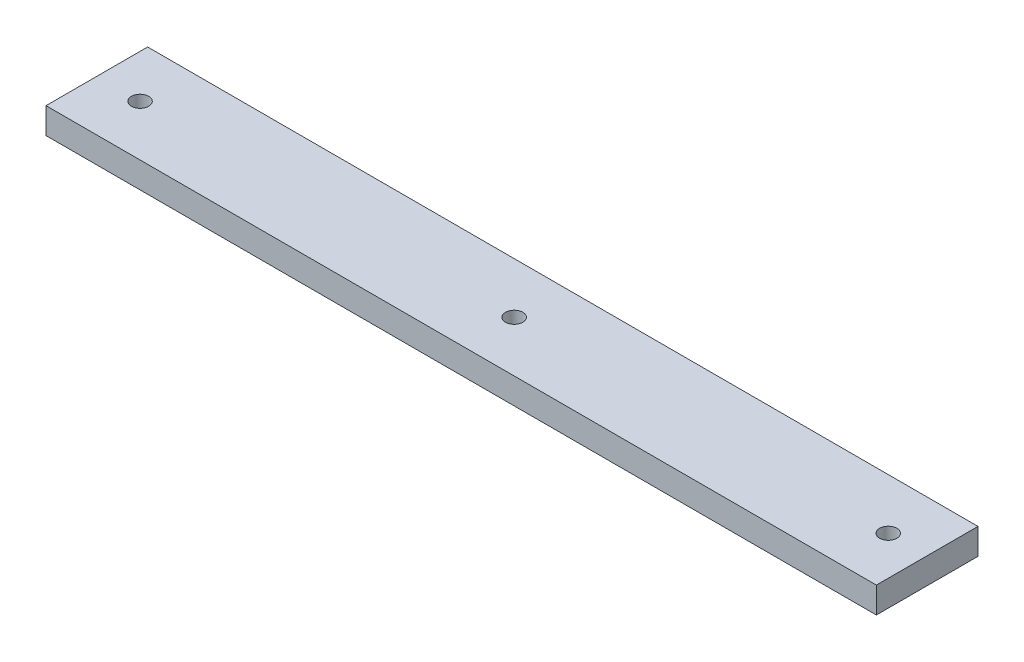
ISO-10303-21;
HEADER;
FILE_DESCRIPTION(('STEP AP214'),'2;1');
FILE_NAME('part.step','',(''),(''),'','','');
FILE_SCHEMA(('AUTOMOTIVE_DESIGN { 1 0 10303 214 1 1 1 1 }'));
ENDSEC;
DATA;
#1=APPLICATION_CONTEXT('core data for automotive mechanical design processes');
#2=APPLICATION_PROTOCOL_DEFINITION('international standard','automotive_design',2000,#1);
#3=PRODUCT_CONTEXT('',#1,'mechanical');
#4=PRODUCT('Part','Part','',(#3));
#5=PRODUCT_RELATED_PRODUCT_CATEGORY('part','',(#4));
#6=PRODUCT_DEFINITION_FORMATION('','',#4);
#7=PRODUCT_DEFINITION_CONTEXT('part definition',#1,'design');
#8=PRODUCT_DEFINITION('design','',#6,#7);
#9=PRODUCT_DEFINITION_SHAPE('','',#8);
#10=(LENGTH_UNIT() NAMED_UNIT(*) SI_UNIT(.MILLI.,.METRE.));
#11=(NAMED_UNIT(*) PLANE_ANGLE_UNIT() SI_UNIT($,.RADIAN.));
#12=(NAMED_UNIT(*) SI_UNIT($,.STERADIAN.) SOLID_ANGLE_UNIT());
#13=UNCERTAINTY_MEASURE_WITH_UNIT(LENGTH_MEASURE(1.E-05),#10,'distance_accuracy_value','');
#14=(GEOMETRIC_REPRESENTATION_CONTEXT(3) GLOBAL_UNCERTAINTY_ASSIGNED_CONTEXT((#13)) GLOBAL_UNIT_ASSIGNED_CONTEXT((#10,
#11,#12)) REPRESENTATION_CONTEXT('',''));
#15=CARTESIAN_POINT('',(0.,0.,0.));
#16=DIRECTION('',(0.,0.,1.));
#17=DIRECTION('',(1.,0.,0.));
#18=AXIS2_PLACEMENT_3D('',#15,#16,#17);
#19=CARTESIAN_POINT('',(-304.8,19.05,37.3062500000001));
#20=DIRECTION('',(1.,0.,0.));
#21=DIRECTION('',(0.,0.,-1.));
#22=AXIS2_PLACEMENT_3D('',#19,#20,#21);
#23=PLANE('',#22);
#24=DIRECTION('',(0.,0.,1.));
#25=VECTOR('',#24,1.);
#26=CARTESIAN_POINT('',(-304.8,0.,37.3062500000001));
#27=LINE('',#26,#25);
#28=CARTESIAN_POINT('',(-304.8,0.,-37.3062499999999));
#29=VERTEX_POINT('',#28);
#30=CARTESIAN_POINT('',(-304.8,0.,37.3062500000001));
#31=VERTEX_POINT('',#30);
#32=EDGE_CURVE('E105',#29,#31,#27,.T.);
#33=ORIENTED_EDGE('',*,*,#32,.T.);
#34=DIRECTION('',(0.,-1.,0.));
#35=VECTOR('',#34,1.);
#36=CARTESIAN_POINT('',(-304.8,19.05,37.3062500000001));
#37=LINE('',#36,#35);
#38=CARTESIAN_POINT('',(-304.8,19.05,37.3062500000001));
#39=VERTEX_POINT('',#38);
#40=EDGE_CURVE('E12',#39,#31,#37,.T.);
#41=ORIENTED_EDGE('',*,*,#40,.F.);
#42=DIRECTION('',(0.,0.,1.));
#43=VECTOR('',#42,1.);
#44=CARTESIAN_POINT('',(-304.8,19.05,37.3062500000001));
#45=LINE('',#44,#43);
#46=CARTESIAN_POINT('',(-304.8,19.05,-37.3062499999999));
#47=VERTEX_POINT('',#46);
#48=EDGE_CURVE('E93',#47,#39,#45,.T.);
#49=ORIENTED_EDGE('',*,*,#48,.F.);
#50=DIRECTION('',(0.,-1.,0.));
#51=VECTOR('',#50,1.);
#52=CARTESIAN_POINT('',(-304.8,19.05,-37.3062499999999));
#53=LINE('',#52,#51);
#54=EDGE_CURVE('E101',#47,#29,#53,.T.);
#55=ORIENTED_EDGE('',*,*,#54,.T.);
#56=EDGE_LOOP('',(#33,#41,#49,#55));
#57=FACE_BOUND('',#56,.T.);
#58=ADVANCED_FACE('F42',(#57),#23,.F.);
#59=CARTESIAN_POINT('',(304.8,19.05,37.30625));
#60=DIRECTION('',(0.,0.,-1.));
#61=DIRECTION('',(-1.,0.,0.));
#62=AXIS2_PLACEMENT_3D('',#59,#60,#61);
#63=PLANE('',#62);
#64=DIRECTION('',(1.,0.,0.));
#65=VECTOR('',#64,1.);
#66=CARTESIAN_POINT('',(304.8,0.,37.30625));
#67=LINE('',#66,#65);
#68=CARTESIAN_POINT('',(304.8,0.,37.30625));
#69=VERTEX_POINT('',#68);
#70=EDGE_CURVE('E97',#31,#69,#67,.T.);
#71=ORIENTED_EDGE('',*,*,#70,.T.);
#72=DIRECTION('',(0.,-1.,0.));
#73=VECTOR('',#72,1.);
#74=CARTESIAN_POINT('',(304.8,19.05,37.30625));
#75=LINE('',#74,#73);
#76=CARTESIAN_POINT('',(304.8,19.05,37.30625));
#77=VERTEX_POINT('',#76);
#78=EDGE_CURVE('E50',#77,#69,#75,.T.);
#79=ORIENTED_EDGE('',*,*,#78,.F.);
#80=DIRECTION('',(1.,0.,0.));
#81=VECTOR('',#80,1.);
#82=CARTESIAN_POINT('',(304.8,19.05,37.30625));
#83=LINE('',#82,#81);
#84=EDGE_CURVE('E88',#39,#77,#83,.T.);
#85=ORIENTED_EDGE('',*,*,#84,.F.);
#86=ORIENTED_EDGE('',*,*,#40,.T.);
#87=EDGE_LOOP('',(#71,#79,#85,#86));
#88=FACE_BOUND('',#87,.T.);
#89=ADVANCED_FACE('F96',(#88),#63,.F.);
#90=CARTESIAN_POINT('',(304.8,19.05,37.30625));
#91=DIRECTION('',(-1.,0.,0.));
#92=DIRECTION('',(0.,0.,1.));
#93=AXIS2_PLACEMENT_3D('',#90,#91,#92);
#94=PLANE('',#93);
#95=DIRECTION('',(0.,0.,-1.));
#96=VECTOR('',#95,1.);
#97=CARTESIAN_POINT('',(304.8,0.,37.30625));
#98=LINE('',#97,#96);
#99=CARTESIAN_POINT('',(304.8,0.,-37.30625));
#100=VERTEX_POINT('',#99);
#101=EDGE_CURVE('E75',#69,#100,#98,.T.);
#102=ORIENTED_EDGE('',*,*,#101,.T.);
#103=DIRECTION('',(0.,-1.,0.));
#104=VECTOR('',#103,1.);
#105=CARTESIAN_POINT('',(304.8,19.05,-37.30625));
#106=LINE('',#105,#104);
#107=CARTESIAN_POINT('',(304.8,19.05,-37.30625));
#108=VERTEX_POINT('',#107);
#109=EDGE_CURVE('E98',#108,#100,#106,.T.);
#110=ORIENTED_EDGE('',*,*,#109,.F.);
#111=DIRECTION('',(0.,0.,-1.));
#112=VECTOR('',#111,1.);
#113=CARTESIAN_POINT('',(304.8,19.05,37.30625));
#114=LINE('',#113,#112);
#115=EDGE_CURVE('E91',#77,#108,#114,.T.);
#116=ORIENTED_EDGE('',*,*,#115,.F.);
#117=ORIENTED_EDGE('',*,*,#78,.T.);
#118=EDGE_LOOP('',(#102,#110,#116,#117));
#119=FACE_BOUND('',#118,.T.);
#120=ADVANCED_FACE('F99',(#119),#94,.F.);
#121=CARTESIAN_POINT('',(304.8,19.05,-37.30625));
#122=DIRECTION('',(0.,0.,1.));
#123=DIRECTION('',(1.,0.,0.));
#124=AXIS2_PLACEMENT_3D('',#121,#122,#123);
#125=PLANE('',#124);
#126=DIRECTION('',(-1.,0.,0.));
#127=VECTOR('',#126,1.);
#128=CARTESIAN_POINT('',(304.8,0.,-37.30625));
#129=LINE('',#128,#127);
#130=EDGE_CURVE('E81',#100,#29,#129,.T.);
#131=ORIENTED_EDGE('',*,*,#130,.T.);
#132=ORIENTED_EDGE('',*,*,#54,.F.);
#133=DIRECTION('',(-1.,0.,0.));
#134=VECTOR('',#133,1.);
#135=CARTESIAN_POINT('',(304.8,19.05,-37.30625));
#136=LINE('',#135,#134);
#137=EDGE_CURVE('E58',#108,#47,#136,.T.);
#138=ORIENTED_EDGE('',*,*,#137,.F.);
#139=ORIENTED_EDGE('',*,*,#109,.T.);
#140=EDGE_LOOP('',(#131,#132,#138,#139));
#141=FACE_BOUND('',#140,.T.);
#142=ADVANCED_FACE('F113',(#141),#125,.F.);
#143=CARTESIAN_POINT('',(0.,19.05,0.));
#144=DIRECTION('',(0.,1.,0.));
#145=DIRECTION('',(0.,0.,1.));
#146=AXIS2_PLACEMENT_3D('',#143,#144,#145);
#147=PLANE('',#146);
#148=CARTESIAN_POINT('',(-273.05,19.05,0.));
#149=DIRECTION('',(0.,-1.,0.));
#150=DIRECTION('',(0.,0.,-1.));
#151=AXIS2_PLACEMENT_3D('',#148,#149,#150);
#152=CIRCLE('',#151,6.35);
#153=CARTESIAN_POINT('',(-273.05,19.05,-6.35000000000003));
#154=VERTEX_POINT('',#153);
#155=EDGE_CURVE('E139',#154,#154,#152,.T.);
#156=ORIENTED_EDGE('',*,*,#155,.T.);
#157=EDGE_LOOP('',(#156));
#158=FACE_BOUND('',#157,.T.);
#159=CARTESIAN_POINT('',(276.225,19.05,0.));
#160=DIRECTION('',(0.,-1.,0.));
#161=DIRECTION('',(0.,0.,-1.));
#162=AXIS2_PLACEMENT_3D('',#159,#160,#161);
#163=CIRCLE('',#162,6.35);
#164=CARTESIAN_POINT('',(276.225,19.05,-6.35));
#165=VERTEX_POINT('',#164);
#166=EDGE_CURVE('E147',#165,#165,#163,.T.);
#167=ORIENTED_EDGE('',*,*,#166,.T.);
#168=EDGE_LOOP('',(#167));
#169=FACE_BOUND('',#168,.T.);
#170=CARTESIAN_POINT('',(1.58749999999991,19.05,0.));
#171=DIRECTION('',(0.,-1.,0.));
#172=DIRECTION('',(0.,0.,-1.));
#173=AXIS2_PLACEMENT_3D('',#170,#171,#172);
#174=CIRCLE('',#173,6.35);
#175=CARTESIAN_POINT('',(1.58749999999991,19.05,-6.35000000000004));
#176=VERTEX_POINT('',#175);
#177=EDGE_CURVE('E126',#176,#176,#174,.T.);
#178=ORIENTED_EDGE('',*,*,#177,.T.);
#179=EDGE_LOOP('',(#178));
#180=FACE_BOUND('',#179,.T.);
#181=ORIENTED_EDGE('',*,*,#48,.T.);
#182=ORIENTED_EDGE('',*,*,#84,.T.);
#183=ORIENTED_EDGE('',*,*,#115,.T.);
#184=ORIENTED_EDGE('',*,*,#137,.T.);
#185=EDGE_LOOP('',(#181,#182,#183,#184));
#186=FACE_BOUND('',#185,.T.);
#187=ADVANCED_FACE('F89',(#158,#169,#180,#186),#147,.T.);
#188=CARTESIAN_POINT('',(0.,0.,0.));
#189=DIRECTION('',(0.,1.,0.));
#190=DIRECTION('',(0.,0.,1.));
#191=AXIS2_PLACEMENT_3D('',#188,#189,#190);
#192=PLANE('',#191);
#193=CARTESIAN_POINT('',(-273.05,0.,0.));
#194=DIRECTION('',(0.,-1.,0.));
#195=DIRECTION('',(0.,0.,-1.));
#196=AXIS2_PLACEMENT_3D('',#193,#194,#195);
#197=CIRCLE('',#196,3.17499999999997);
#198=CARTESIAN_POINT('',(-273.05,0.,-3.175));
#199=VERTEX_POINT('',#198);
#200=EDGE_CURVE('E138',#199,#199,#197,.T.);
#201=ORIENTED_EDGE('',*,*,#200,.F.);
#202=EDGE_LOOP('',(#201));
#203=FACE_BOUND('',#202,.T.);
#204=CARTESIAN_POINT('',(276.225,0.,0.));
#205=DIRECTION('',(0.,-1.,0.));
#206=DIRECTION('',(0.,0.,-1.));
#207=AXIS2_PLACEMENT_3D('',#204,#205,#206);
#208=CIRCLE('',#207,3.17499999999997);
#209=CARTESIAN_POINT('',(276.225,0.,-3.17499999999997));
#210=VERTEX_POINT('',#209);
#211=EDGE_CURVE('E157',#210,#210,#208,.T.);
#212=ORIENTED_EDGE('',*,*,#211,.F.);
#213=EDGE_LOOP('',(#212));
#214=FACE_BOUND('',#213,.T.);
#215=CARTESIAN_POINT('',(1.58749999999991,0.,0.));
#216=DIRECTION('',(0.,-1.,0.));
#217=DIRECTION('',(0.,0.,-1.));
#218=AXIS2_PLACEMENT_3D('',#215,#216,#217);
#219=CIRCLE('',#218,3.175);
#220=CARTESIAN_POINT('',(1.58749999999991,0.,-3.17500000000004));
#221=VERTEX_POINT('',#220);
#222=EDGE_CURVE('E108',#221,#221,#219,.T.);
#223=ORIENTED_EDGE('',*,*,#222,.F.);
#224=EDGE_LOOP('',(#223));
#225=FACE_BOUND('',#224,.T.);
#226=ORIENTED_EDGE('',*,*,#32,.F.);
#227=ORIENTED_EDGE('',*,*,#130,.F.);
#228=ORIENTED_EDGE('',*,*,#101,.F.);
#229=ORIENTED_EDGE('',*,*,#70,.F.);
#230=EDGE_LOOP('',(#226,#227,#228,#229));
#231=FACE_BOUND('',#230,.T.);
#232=ADVANCED_FACE('F116',(#203,#214,#225,#231),#192,.F.);
#233=CARTESIAN_POINT('',(1.58749999999991,9.525,0.));
#234=DIRECTION('',(0.,-1.,0.));
#235=DIRECTION('',(0.,0.,-1.));
#236=AXIS2_PLACEMENT_3D('',#233,#234,#235);
#237=CYLINDRICAL_SURFACE('',#236,3.175);
#238=CARTESIAN_POINT('',(1.58749999999991,9.525,0.));
#239=DIRECTION('',(0.,-1.,0.));
#240=DIRECTION('',(0.,0.,-1.));
#241=AXIS2_PLACEMENT_3D('',#238,#239,#240);
#242=CIRCLE('',#241,3.175);
#243=CARTESIAN_POINT('',(1.58749999999991,9.525,-3.17500000000004));
#244=VERTEX_POINT('',#243);
#245=EDGE_CURVE('E121',#244,#244,#242,.T.);
#246=CARTESIAN_POINT('',(1.58749999999991,9.525,-3.17500000000004));
#247=CARTESIAN_POINT('',(1.58749999999991,9.42578125,-3.17500000000004));
#248=CARTESIAN_POINT('',(1.58749999999991,9.3265625,-3.17500000000004));
#249=CARTESIAN_POINT('',(1.58749999999991,9.128125,-3.17500000000004));
#250=CARTESIAN_POINT('',(1.58749999999991,9.02890625,-3.17500000000004));
#251=CARTESIAN_POINT('',(1.58749999999991,8.83046875,-3.17500000000004));
#252=CARTESIAN_POINT('',(1.58749999999991,8.73125,-3.17500000000004));
#253=CARTESIAN_POINT('',(1.58749999999991,8.5328125,-3.17500000000004));
#254=CARTESIAN_POINT('',(1.58749999999991,8.43359375,-3.17500000000004));
#255=CARTESIAN_POINT('',(1.58749999999991,8.23515625,-3.17500000000004));
#256=CARTESIAN_POINT('',(1.58749999999991,8.1359375,-3.17500000000004));
#257=CARTESIAN_POINT('',(1.58749999999991,7.9375,-3.17500000000004));
#258=CARTESIAN_POINT('',(1.58749999999991,7.83828125,-3.17500000000004));
#259=CARTESIAN_POINT('',(1.58749999999991,7.63984375,-3.17500000000004));
#260=CARTESIAN_POINT('',(1.58749999999991,7.540625,-3.17500000000004));
#261=CARTESIAN_POINT('',(1.58749999999991,7.3421875,-3.17500000000004));
#262=CARTESIAN_POINT('',(1.58749999999991,7.24296875,-3.17500000000004));
#263=CARTESIAN_POINT('',(1.58749999999991,7.04453125,-3.17500000000004));
#264=CARTESIAN_POINT('',(1.58749999999991,6.9453125,-3.17500000000004));
#265=CARTESIAN_POINT('',(1.58749999999991,6.746875,-3.17500000000004));
#266=CARTESIAN_POINT('',(1.58749999999991,6.64765625,-3.17500000000004));
#267=CARTESIAN_POINT('',(1.58749999999991,6.44921875,-3.17500000000004));
#268=CARTESIAN_POINT('',(1.58749999999991,6.35,-3.17500000000004));
#269=CARTESIAN_POINT('',(1.58749999999991,6.1515625,-3.17500000000004));
#270=CARTESIAN_POINT('',(1.58749999999991,6.05234375,-3.17500000000004));
#271=CARTESIAN_POINT('',(1.58749999999991,5.85390625,-3.17500000000004));
#272=CARTESIAN_POINT('',(1.58749999999991,5.7546875,-3.17500000000004));
#273=CARTESIAN_POINT('',(1.58749999999991,5.55625,-3.17500000000004));
#274=CARTESIAN_POINT('',(1.58749999999991,5.45703125,-3.17500000000004));
#275=CARTESIAN_POINT('',(1.58749999999991,5.25859375,-3.17500000000004));
#276=CARTESIAN_POINT('',(1.58749999999991,5.159375,-3.17500000000004));
#277=CARTESIAN_POINT('',(1.58749999999991,4.9609375,-3.17500000000004));
#278=CARTESIAN_POINT('',(1.58749999999991,4.86171875,-3.17500000000004));
#279=CARTESIAN_POINT('',(1.58749999999991,4.66328125,-3.17500000000004));
#280=CARTESIAN_POINT('',(1.58749999999991,4.5640625,-3.17500000000004));
#281=CARTESIAN_POINT('',(1.58749999999991,4.365625,-3.17500000000004));
#282=CARTESIAN_POINT('',(1.58749999999991,4.26640625,-3.17500000000004));
#283=CARTESIAN_POINT('',(1.58749999999991,4.06796875,-3.17500000000004));
#284=CARTESIAN_POINT('',(1.58749999999991,3.96875,-3.17500000000004));
#285=CARTESIAN_POINT('',(1.58749999999991,3.7703125,-3.17500000000004));
#286=CARTESIAN_POINT('',(1.58749999999991,3.67109375,-3.17500000000004));
#287=CARTESIAN_POINT('',(1.58749999999991,3.47265625,-3.17500000000004));
#288=CARTESIAN_POINT('',(1.58749999999991,3.3734375,-3.17500000000004));
#289=CARTESIAN_POINT('',(1.58749999999991,3.175,-3.17500000000004));
#290=CARTESIAN_POINT('',(1.58749999999991,3.07578125,-3.17500000000004));
#291=CARTESIAN_POINT('',(1.58749999999991,2.87734375,-3.17500000000004));
#292=CARTESIAN_POINT('',(1.58749999999991,2.778125,-3.17500000000004));
#293=CARTESIAN_POINT('',(1.58749999999991,2.5796875,-3.17500000000004));
#294=CARTESIAN_POINT('',(1.58749999999991,2.48046875,-3.17500000000004));
#295=CARTESIAN_POINT('',(1.58749999999991,2.28203125,-3.17500000000004));
#296=CARTESIAN_POINT('',(1.58749999999991,2.1828125,-3.17500000000004));
#297=CARTESIAN_POINT('',(1.58749999999991,1.984375,-3.17500000000004));
#298=CARTESIAN_POINT('',(1.58749999999991,1.88515625,-3.17500000000004));
#299=CARTESIAN_POINT('',(1.58749999999991,1.68671875,-3.17500000000004));
#300=CARTESIAN_POINT('',(1.58749999999991,1.5875,-3.17500000000004));
#301=CARTESIAN_POINT('',(1.58749999999991,1.3890625,-3.17500000000004));
#302=CARTESIAN_POINT('',(1.58749999999991,1.28984375,-3.17500000000004));
#303=CARTESIAN_POINT('',(1.58749999999991,1.09140625,-3.17500000000004));
#304=CARTESIAN_POINT('',(1.58749999999991,0.992187500000001,-3.17500000000004));
#305=CARTESIAN_POINT('',(1.58749999999991,0.793750000000001,-3.17500000000004));
#306=CARTESIAN_POINT('',(1.58749999999991,0.69453125,-3.17500000000004));
#307=CARTESIAN_POINT('',(1.58749999999991,0.49609375,-3.17500000000004));
#308=CARTESIAN_POINT('',(1.58749999999991,0.396875,-3.17500000000004));
#309=CARTESIAN_POINT('',(1.58749999999991,0.1984375,-3.17500000000004));
#310=CARTESIAN_POINT('',(1.58749999999991,0.0992187500000001,-3.17500000000004));
#311=CARTESIAN_POINT('',(1.58749999999991,0.,-3.17500000000004));
#312=B_SPLINE_CURVE_WITH_KNOTS('',3,(#246,#247,#248,#249,#250,#251,#252,#253,#254,#255,#256,
#257,#258,#259,#260,#261,#262,#263,#264,#265,#266,#267,#268,#269,#270,#271,#272,#273,#274,#275,
#276,#277,#278,#279,#280,#281,#282,#283,#284,#285,#286,#287,#288,#289,#290,#291,#292,#293,#294,
#295,#296,#297,#298,#299,#300,#301,#302,#303,#304,#305,#306,#307,#308,#309,#310,#311),
.UNSPECIFIED.,.F.,.F.,(4,2,2,2,2,2,2,2,2,2,2,2,2,2,2,2,2,2,2,2,2,2,2,2,2,2,2,2,2,2,2,2,4),(0.,
0.297656249999998,0.595312499999999,0.892968749999999,1.190625,1.48828125,1.7859375,2.08359375,
2.38125,2.67890625,2.9765625,3.27421875,3.571875,3.86953125,4.1671875,4.46484375,4.7625,
5.06015625,5.3578125,5.65546875,5.953125,6.25078125,6.5484375,6.84609375,7.14375,7.44140625,
7.7390625,8.03671875,8.334375,8.63203125,8.9296875,9.22734375,9.525),.UNSPECIFIED.);
#313=EDGE_CURVE('BSEAM181',#244,#221,#312,.T.);
#314=ORIENTED_EDGE('',*,*,#245,.F.);
#315=ORIENTED_EDGE('',*,*,#222,.T.);
#316=ORIENTED_EDGE('',*,*,#313,.T.);
#317=ORIENTED_EDGE('',*,*,#313,.F.);
#318=EDGE_LOOP('',(#314,#316,#315,#317));
#319=FACE_BOUND('',#318,.T.);
#320=ADVANCED_FACE('F181',(#319),#237,.F.);
#321=CARTESIAN_POINT('',(1.58749999999991,19.05,0.));
#322=DIRECTION('',(0.,-1.,0.));
#323=DIRECTION('',(0.,0.,-1.));
#324=AXIS2_PLACEMENT_3D('',#321,#322,#323);
#325=CYLINDRICAL_SURFACE('',#324,6.35);
#326=CARTESIAN_POINT('',(1.58749999999991,9.525,0.));
#327=DIRECTION('',(0.,-1.,0.));
#328=DIRECTION('',(0.,0.,-1.));
#329=AXIS2_PLACEMENT_3D('',#326,#327,#328);
#330=CIRCLE('',#329,6.35);
#331=CARTESIAN_POINT('',(1.58749999999991,9.525,-6.35000000000004));
#332=VERTEX_POINT('',#331);
#333=EDGE_CURVE('E127',#332,#332,#330,.T.);
#334=CARTESIAN_POINT('',(1.58749999999991,19.05,-6.35000000000004));
#335=CARTESIAN_POINT('',(1.58749999999991,18.95078125,-6.35000000000004));
#336=CARTESIAN_POINT('',(1.58749999999991,18.8515625,-6.35000000000004));
#337=CARTESIAN_POINT('',(1.58749999999991,18.653125,-6.35000000000004));
#338=CARTESIAN_POINT('',(1.58749999999991,18.55390625,-6.35000000000004));
#339=CARTESIAN_POINT('',(1.58749999999991,18.35546875,-6.35000000000004));
#340=CARTESIAN_POINT('',(1.58749999999991,18.25625,-6.35000000000004));
#341=CARTESIAN_POINT('',(1.58749999999991,18.0578125,-6.35000000000004));
#342=CARTESIAN_POINT('',(1.58749999999991,17.95859375,-6.35000000000004));
#343=CARTESIAN_POINT('',(1.58749999999991,17.76015625,-6.35000000000004));
#344=CARTESIAN_POINT('',(1.58749999999991,17.6609375,-6.35000000000004));
#345=CARTESIAN_POINT('',(1.58749999999991,17.4625,-6.35000000000004));
#346=CARTESIAN_POINT('',(1.58749999999991,17.36328125,-6.35000000000004));
#347=CARTESIAN_POINT('',(1.58749999999991,17.16484375,-6.35000000000004));
#348=CARTESIAN_POINT('',(1.58749999999991,17.065625,-6.35000000000004));
#349=CARTESIAN_POINT('',(1.58749999999991,16.8671875,-6.35000000000004));
#350=CARTESIAN_POINT('',(1.58749999999991,16.76796875,-6.35000000000004));
#351=CARTESIAN_POINT('',(1.58749999999991,16.56953125,-6.35000000000004));
#352=CARTESIAN_POINT('',(1.58749999999991,16.4703125,-6.35000000000004));
#353=CARTESIAN_POINT('',(1.58749999999991,16.271875,-6.35000000000004));
#354=CARTESIAN_POINT('',(1.58749999999991,16.17265625,-6.35000000000004));
#355=CARTESIAN_POINT('',(1.58749999999991,15.97421875,-6.35000000000004));
#356=CARTESIAN_POINT('',(1.58749999999991,15.875,-6.35000000000004));
#357=CARTESIAN_POINT('',(1.58749999999991,15.6765625,-6.35000000000004));
#358=CARTESIAN_POINT('',(1.58749999999991,15.57734375,-6.35000000000004));
#359=CARTESIAN_POINT('',(1.58749999999991,15.37890625,-6.35000000000004));
#360=CARTESIAN_POINT('',(1.58749999999991,15.2796875,-6.35000000000004));
#361=CARTESIAN_POINT('',(1.58749999999991,15.08125,-6.35000000000004));
#362=CARTESIAN_POINT('',(1.58749999999991,14.98203125,-6.35000000000004));
#363=CARTESIAN_POINT('',(1.58749999999991,14.78359375,-6.35000000000004));
#364=CARTESIAN_POINT('',(1.58749999999991,14.684375,-6.35000000000004));
#365=CARTESIAN_POINT('',(1.58749999999991,14.4859375,-6.35000000000004));
#366=CARTESIAN_POINT('',(1.58749999999991,14.38671875,-6.35000000000004));
#367=CARTESIAN_POINT('',(1.58749999999991,14.18828125,-6.35000000000004));
#368=CARTESIAN_POINT('',(1.58749999999991,14.0890625,-6.35000000000004));
#369=CARTESIAN_POINT('',(1.58749999999991,13.890625,-6.35000000000004));
#370=CARTESIAN_POINT('',(1.58749999999991,13.79140625,-6.35000000000004));
#371=CARTESIAN_POINT('',(1.58749999999991,13.59296875,-6.35000000000004));
#372=CARTESIAN_POINT('',(1.58749999999991,13.49375,-6.35000000000004));
#373=CARTESIAN_POINT('',(1.58749999999991,13.2953125,-6.35000000000004));
#374=CARTESIAN_POINT('',(1.58749999999991,13.19609375,-6.35000000000004));
#375=CARTESIAN_POINT('',(1.58749999999991,12.99765625,-6.35000000000004));
#376=CARTESIAN_POINT('',(1.58749999999991,12.8984375,-6.35000000000004));
#377=CARTESIAN_POINT('',(1.58749999999991,12.7,-6.35000000000004));
#378=CARTESIAN_POINT('',(1.58749999999991,12.60078125,-6.35000000000004));
#379=CARTESIAN_POINT('',(1.58749999999991,12.40234375,-6.35000000000004));
#380=CARTESIAN_POINT('',(1.58749999999991,12.303125,-6.35000000000004));
#381=CARTESIAN_POINT('',(1.58749999999991,12.1046875,-6.35000000000004));
#382=CARTESIAN_POINT('',(1.58749999999991,12.00546875,-6.35000000000004));
#383=CARTESIAN_POINT('',(1.58749999999991,11.80703125,-6.35000000000004));
#384=CARTESIAN_POINT('',(1.58749999999991,11.7078125,-6.35000000000004));
#385=CARTESIAN_POINT('',(1.58749999999991,11.509375,-6.35000000000004));
#386=CARTESIAN_POINT('',(1.58749999999991,11.41015625,-6.35000000000004));
#387=CARTESIAN_POINT('',(1.58749999999991,11.21171875,-6.35000000000004));
#388=CARTESIAN_POINT('',(1.58749999999991,11.1125,-6.35000000000004));
#389=CARTESIAN_POINT('',(1.58749999999991,10.9140625,-6.35000000000004));
#390=CARTESIAN_POINT('',(1.58749999999991,10.81484375,-6.35000000000004));
#391=CARTESIAN_POINT('',(1.58749999999991,10.61640625,-6.35000000000004));
#392=CARTESIAN_POINT('',(1.58749999999991,10.5171875,-6.35000000000004));
#393=CARTESIAN_POINT('',(1.58749999999991,10.31875,-6.35000000000004));
#394=CARTESIAN_POINT('',(1.58749999999991,10.21953125,-6.35000000000004));
#395=CARTESIAN_POINT('',(1.58749999999991,10.02109375,-6.35000000000004));
#396=CARTESIAN_POINT('',(1.58749999999991,9.921875,-6.35000000000004));
#397=CARTESIAN_POINT('',(1.58749999999991,9.7234375,-6.35000000000004));
#398=CARTESIAN_POINT('',(1.58749999999991,9.62421875,-6.35000000000004));
#399=CARTESIAN_POINT('',(1.58749999999991,9.525,-6.35000000000004));
#400=B_SPLINE_CURVE_WITH_KNOTS('',3,(#334,#335,#336,#337,#338,#339,#340,#341,#342,#343,#344,
#345,#346,#347,#348,#349,#350,#351,#352,#353,#354,#355,#356,#357,#358,#359,#360,#361,#362,#363,
#364,#365,#366,#367,#368,#369,#370,#371,#372,#373,#374,#375,#376,#377,#378,#379,#380,#381,#382,
#383,#384,#385,#386,#387,#388,#389,#390,#391,#392,#393,#394,#395,#396,#397,#398,#399),
.UNSPECIFIED.,.F.,.F.,(4,2,2,2,2,2,2,2,2,2,2,2,2,2,2,2,2,2,2,2,2,2,2,2,2,2,2,2,2,2,2,2,4),(0.,
0.297656249999997,0.595312499999997,0.892968749999997,1.190625,1.48828125,1.7859375,2.08359375,
2.38125,2.67890625,2.9765625,3.27421875,3.571875,3.86953125,4.1671875,4.46484375,4.7625,
5.06015625,5.3578125,5.65546875,5.953125,6.25078125,6.5484375,6.84609375,7.14375,7.44140625,
7.7390625,8.03671875,8.334375,8.63203125,8.9296875,9.22734375,9.525),.UNSPECIFIED.);
#401=EDGE_CURVE('BSEAM167',#176,#332,#400,.T.);
#402=ORIENTED_EDGE('',*,*,#177,.F.);
#403=ORIENTED_EDGE('',*,*,#333,.T.);
#404=ORIENTED_EDGE('',*,*,#401,.T.);
#405=ORIENTED_EDGE('',*,*,#401,.F.);
#406=EDGE_LOOP('',(#402,#404,#403,#405));
#407=FACE_BOUND('',#406,.T.);
#408=ADVANCED_FACE('F167',(#407),#325,.F.);
#409=CARTESIAN_POINT('',(1.58749999999991,9.525,0.));
#410=DIRECTION('',(0.,-1.,0.));
#411=DIRECTION('',(0.,0.,-1.));
#412=AXIS2_PLACEMENT_3D('',#409,#410,#411);
#413=PLANE('',#412);
#414=ORIENTED_EDGE('',*,*,#245,.T.);
#415=EDGE_LOOP('',(#414));
#416=FACE_BOUND('',#415,.T.);
#417=ORIENTED_EDGE('',*,*,#333,.F.);
#418=EDGE_LOOP('',(#417));
#419=FACE_BOUND('',#418,.T.);
#420=ADVANCED_FACE('F169',(#416,#419),#413,.F.);
#421=CARTESIAN_POINT('',(276.225,9.525,0.));
#422=DIRECTION('',(0.,-1.,0.));
#423=DIRECTION('',(0.,0.,-1.));
#424=AXIS2_PLACEMENT_3D('',#421,#422,#423);
#425=CYLINDRICAL_SURFACE('',#424,3.17499999999997);
#426=CARTESIAN_POINT('',(276.225,9.525,0.));
#427=DIRECTION('',(0.,-1.,0.));
#428=DIRECTION('',(0.,0.,-1.));
#429=AXIS2_PLACEMENT_3D('',#426,#427,#428);
#430=CIRCLE('',#429,3.17499999999997);
#431=CARTESIAN_POINT('',(276.225,9.525,-3.17499999999997));
#432=VERTEX_POINT('',#431);
#433=EDGE_CURVE('E151',#432,#432,#430,.T.);
#434=CARTESIAN_POINT('',(276.225,9.525,-3.17499999999997));
#435=CARTESIAN_POINT('',(276.225,9.42578125,-3.17499999999997));
#436=CARTESIAN_POINT('',(276.225,9.3265625,-3.17499999999997));
#437=CARTESIAN_POINT('',(276.225,9.128125,-3.17499999999997));
#438=CARTESIAN_POINT('',(276.225,9.02890625,-3.17499999999997));
#439=CARTESIAN_POINT('',(276.225,8.83046875,-3.17499999999997));
#440=CARTESIAN_POINT('',(276.225,8.73125,-3.17499999999997));
#441=CARTESIAN_POINT('',(276.225,8.5328125,-3.17499999999997));
#442=CARTESIAN_POINT('',(276.225,8.43359375,-3.17499999999997));
#443=CARTESIAN_POINT('',(276.225,8.23515625,-3.17499999999997));
#444=CARTESIAN_POINT('',(276.225,8.1359375,-3.17499999999997));
#445=CARTESIAN_POINT('',(276.225,7.9375,-3.17499999999997));
#446=CARTESIAN_POINT('',(276.225,7.83828125,-3.17499999999997));
#447=CARTESIAN_POINT('',(276.225,7.63984375,-3.17499999999997));
#448=CARTESIAN_POINT('',(276.225,7.540625,-3.17499999999997));
#449=CARTESIAN_POINT('',(276.225,7.3421875,-3.17499999999997));
#450=CARTESIAN_POINT('',(276.225,7.24296875,-3.17499999999997));
#451=CARTESIAN_POINT('',(276.225,7.04453125,-3.17499999999997));
#452=CARTESIAN_POINT('',(276.225,6.9453125,-3.17499999999997));
#453=CARTESIAN_POINT('',(276.225,6.746875,-3.17499999999997));
#454=CARTESIAN_POINT('',(276.225,6.64765625,-3.17499999999997));
#455=CARTESIAN_POINT('',(276.225,6.44921875,-3.17499999999997));
#456=CARTESIAN_POINT('',(276.225,6.35,-3.17499999999997));
#457=CARTESIAN_POINT('',(276.225,6.1515625,-3.17499999999997));
#458=CARTESIAN_POINT('',(276.225,6.05234375,-3.17499999999997));
#459=CARTESIAN_POINT('',(276.225,5.85390625,-3.17499999999997));
#460=CARTESIAN_POINT('',(276.225,5.7546875,-3.17499999999997));
#461=CARTESIAN_POINT('',(276.225,5.55625,-3.17499999999997));
#462=CARTESIAN_POINT('',(276.225,5.45703125,-3.17499999999997));
#463=CARTESIAN_POINT('',(276.225,5.25859375,-3.17499999999997));
#464=CARTESIAN_POINT('',(276.225,5.159375,-3.17499999999997));
#465=CARTESIAN_POINT('',(276.225,4.9609375,-3.17499999999997));
#466=CARTESIAN_POINT('',(276.225,4.86171875,-3.17499999999997));
#467=CARTESIAN_POINT('',(276.225,4.66328125,-3.17499999999997));
#468=CARTESIAN_POINT('',(276.225,4.5640625,-3.17499999999997));
#469=CARTESIAN_POINT('',(276.225,4.365625,-3.17499999999997));
#470=CARTESIAN_POINT('',(276.225,4.26640625,-3.17499999999997));
#471=CARTESIAN_POINT('',(276.225,4.06796875,-3.17499999999997));
#472=CARTESIAN_POINT('',(276.225,3.96875,-3.17499999999997));
#473=CARTESIAN_POINT('',(276.225,3.7703125,-3.17499999999997));
#474=CARTESIAN_POINT('',(276.225,3.67109375,-3.17499999999997));
#475=CARTESIAN_POINT('',(276.225,3.47265625,-3.17499999999997));
#476=CARTESIAN_POINT('',(276.225,3.3734375,-3.17499999999997));
#477=CARTESIAN_POINT('',(276.225,3.175,-3.17499999999997));
#478=CARTESIAN_POINT('',(276.225,3.07578125,-3.17499999999997));
#479=CARTESIAN_POINT('',(276.225,2.87734375,-3.17499999999997));
#480=CARTESIAN_POINT('',(276.225,2.778125,-3.17499999999997));
#481=CARTESIAN_POINT('',(276.225,2.5796875,-3.17499999999997));
#482=CARTESIAN_POINT('',(276.225,2.48046875,-3.17499999999997));
#483=CARTESIAN_POINT('',(276.225,2.28203125,-3.17499999999997));
#484=CARTESIAN_POINT('',(276.225,2.1828125,-3.17499999999997));
#485=CARTESIAN_POINT('',(276.225,1.984375,-3.17499999999997));
#486=CARTESIAN_POINT('',(276.225,1.88515625,-3.17499999999997));
#487=CARTESIAN_POINT('',(276.225,1.68671875,-3.17499999999997));
#488=CARTESIAN_POINT('',(276.225,1.5875,-3.17499999999997));
#489=CARTESIAN_POINT('',(276.225,1.3890625,-3.17499999999997));
#490=CARTESIAN_POINT('',(276.225,1.28984375,-3.17499999999997));
#491=CARTESIAN_POINT('',(276.225,1.09140625,-3.17499999999997));
#492=CARTESIAN_POINT('',(276.225,0.992187500000001,-3.17499999999997));
#493=CARTESIAN_POINT('',(276.225,0.793750000000001,-3.17499999999997));
#494=CARTESIAN_POINT('',(276.225,0.69453125,-3.17499999999997));
#495=CARTESIAN_POINT('',(276.225,0.49609375,-3.17499999999997));
#496=CARTESIAN_POINT('',(276.225,0.396875,-3.17499999999997));
#497=CARTESIAN_POINT('',(276.225,0.1984375,-3.17499999999997));
#498=CARTESIAN_POINT('',(276.225,0.0992187500000001,-3.17499999999997));
#499=CARTESIAN_POINT('',(276.225,0.,-3.17499999999997));
#500=B_SPLINE_CURVE_WITH_KNOTS('',3,(#434,#435,#436,#437,#438,#439,#440,#441,#442,#443,#444,
#445,#446,#447,#448,#449,#450,#451,#452,#453,#454,#455,#456,#457,#458,#459,#460,#461,#462,#463,
#464,#465,#466,#467,#468,#469,#470,#471,#472,#473,#474,#475,#476,#477,#478,#479,#480,#481,#482,
#483,#484,#485,#486,#487,#488,#489,#490,#491,#492,#493,#494,#495,#496,#497,#498,#499),
.UNSPECIFIED.,.F.,.F.,(4,2,2,2,2,2,2,2,2,2,2,2,2,2,2,2,2,2,2,2,2,2,2,2,2,2,2,2,2,2,2,2,4),(0.,
0.297656249999998,0.595312499999999,0.892968749999999,1.190625,1.48828125,1.7859375,2.08359375,
2.38125,2.67890625,2.9765625,3.27421875,3.571875,3.86953125,4.1671875,4.46484375,4.7625,
5.06015625,5.3578125,5.65546875,5.953125,6.25078125,6.5484375,6.84609375,7.14375,7.44140625,
7.7390625,8.03671875,8.334375,8.63203125,8.9296875,9.22734375,9.525),.UNSPECIFIED.);
#501=EDGE_CURVE('BSEAM171',#432,#210,#500,.T.);
#502=ORIENTED_EDGE('',*,*,#433,.F.);
#503=ORIENTED_EDGE('',*,*,#211,.T.);
#504=ORIENTED_EDGE('',*,*,#501,.T.);
#505=ORIENTED_EDGE('',*,*,#501,.F.);
#506=EDGE_LOOP('',(#502,#504,#503,#505));
#507=FACE_BOUND('',#506,.T.);
#508=ADVANCED_FACE('F171',(#507),#425,.F.);
#509=CARTESIAN_POINT('',(276.225,19.05,0.));
#510=DIRECTION('',(0.,-1.,0.));
#511=DIRECTION('',(0.,0.,-1.));
#512=AXIS2_PLACEMENT_3D('',#509,#510,#511);
#513=CYLINDRICAL_SURFACE('',#512,6.35);
#514=CARTESIAN_POINT('',(276.225,9.525,0.));
#515=DIRECTION('',(0.,-1.,0.));
#516=DIRECTION('',(0.,0.,-1.));
#517=AXIS2_PLACEMENT_3D('',#514,#515,#516);
#518=CIRCLE('',#517,6.35);
#519=CARTESIAN_POINT('',(276.225,9.525,-6.35));
#520=VERTEX_POINT('',#519);
#521=EDGE_CURVE('E146',#520,#520,#518,.T.);
#522=CARTESIAN_POINT('',(276.225,19.05,-6.35));
#523=CARTESIAN_POINT('',(276.225,18.95078125,-6.35));
#524=CARTESIAN_POINT('',(276.225,18.8515625,-6.35));
#525=CARTESIAN_POINT('',(276.225,18.653125,-6.35));
#526=CARTESIAN_POINT('',(276.225,18.55390625,-6.35));
#527=CARTESIAN_POINT('',(276.225,18.35546875,-6.35));
#528=CARTESIAN_POINT('',(276.225,18.25625,-6.35));
#529=CARTESIAN_POINT('',(276.225,18.0578125,-6.35));
#530=CARTESIAN_POINT('',(276.225,17.95859375,-6.35));
#531=CARTESIAN_POINT('',(276.225,17.76015625,-6.35));
#532=CARTESIAN_POINT('',(276.225,17.6609375,-6.35));
#533=CARTESIAN_POINT('',(276.225,17.4625,-6.35));
#534=CARTESIAN_POINT('',(276.225,17.36328125,-6.35));
#535=CARTESIAN_POINT('',(276.225,17.16484375,-6.35));
#536=CARTESIAN_POINT('',(276.225,17.065625,-6.35));
#537=CARTESIAN_POINT('',(276.225,16.8671875,-6.35));
#538=CARTESIAN_POINT('',(276.225,16.76796875,-6.35));
#539=CARTESIAN_POINT('',(276.225,16.56953125,-6.35));
#540=CARTESIAN_POINT('',(276.225,16.4703125,-6.35));
#541=CARTESIAN_POINT('',(276.225,16.271875,-6.35));
#542=CARTESIAN_POINT('',(276.225,16.17265625,-6.35));
#543=CARTESIAN_POINT('',(276.225,15.97421875,-6.35));
#544=CARTESIAN_POINT('',(276.225,15.875,-6.35));
#545=CARTESIAN_POINT('',(276.225,15.6765625,-6.35));
#546=CARTESIAN_POINT('',(276.225,15.57734375,-6.35));
#547=CARTESIAN_POINT('',(276.225,15.37890625,-6.35));
#548=CARTESIAN_POINT('',(276.225,15.2796875,-6.35));
#549=CARTESIAN_POINT('',(276.225,15.08125,-6.35));
#550=CARTESIAN_POINT('',(276.225,14.98203125,-6.35));
#551=CARTESIAN_POINT('',(276.225,14.78359375,-6.35));
#552=CARTESIAN_POINT('',(276.225,14.684375,-6.35));
#553=CARTESIAN_POINT('',(276.225,14.4859375,-6.35));
#554=CARTESIAN_POINT('',(276.225,14.38671875,-6.35));
#555=CARTESIAN_POINT('',(276.225,14.18828125,-6.35));
#556=CARTESIAN_POINT('',(276.225,14.0890625,-6.35));
#557=CARTESIAN_POINT('',(276.225,13.890625,-6.35));
#558=CARTESIAN_POINT('',(276.225,13.79140625,-6.35));
#559=CARTESIAN_POINT('',(276.225,13.59296875,-6.35));
#560=CARTESIAN_POINT('',(276.225,13.49375,-6.35));
#561=CARTESIAN_POINT('',(276.225,13.2953125,-6.35));
#562=CARTESIAN_POINT('',(276.225,13.19609375,-6.35));
#563=CARTESIAN_POINT('',(276.225,12.99765625,-6.35));
#564=CARTESIAN_POINT('',(276.225,12.8984375,-6.35));
#565=CARTESIAN_POINT('',(276.225,12.7,-6.35));
#566=CARTESIAN_POINT('',(276.225,12.60078125,-6.35));
#567=CARTESIAN_POINT('',(276.225,12.40234375,-6.35));
#568=CARTESIAN_POINT('',(276.225,12.303125,-6.35));
#569=CARTESIAN_POINT('',(276.225,12.1046875,-6.35));
#570=CARTESIAN_POINT('',(276.225,12.00546875,-6.35));
#571=CARTESIAN_POINT('',(276.225,11.80703125,-6.35));
#572=CARTESIAN_POINT('',(276.225,11.7078125,-6.35));
#573=CARTESIAN_POINT('',(276.225,11.509375,-6.35));
#574=CARTESIAN_POINT('',(276.225,11.41015625,-6.35));
#575=CARTESIAN_POINT('',(276.225,11.21171875,-6.35));
#576=CARTESIAN_POINT('',(276.225,11.1125,-6.35));
#577=CARTESIAN_POINT('',(276.225,10.9140625,-6.35));
#578=CARTESIAN_POINT('',(276.225,10.81484375,-6.35));
#579=CARTESIAN_POINT('',(276.225,10.61640625,-6.35));
#580=CARTESIAN_POINT('',(276.225,10.5171875,-6.35));
#581=CARTESIAN_POINT('',(276.225,10.31875,-6.35));
#582=CARTESIAN_POINT('',(276.225,10.21953125,-6.35));
#583=CARTESIAN_POINT('',(276.225,10.02109375,-6.35));
#584=CARTESIAN_POINT('',(276.225,9.921875,-6.35));
#585=CARTESIAN_POINT('',(276.225,9.7234375,-6.35));
#586=CARTESIAN_POINT('',(276.225,9.62421875,-6.35));
#587=CARTESIAN_POINT('',(276.225,9.525,-6.35));
#588=B_SPLINE_CURVE_WITH_KNOTS('',3,(#522,#523,#524,#525,#526,#527,#528,#529,#530,#531,#532,
#533,#534,#535,#536,#537,#538,#539,#540,#541,#542,#543,#544,#545,#546,#547,#548,#549,#550,#551,
#552,#553,#554,#555,#556,#557,#558,#559,#560,#561,#562,#563,#564,#565,#566,#567,#568,#569,#570,
#571,#572,#573,#574,#575,#576,#577,#578,#579,#580,#581,#582,#583,#584,#585,#586,#587),
.UNSPECIFIED.,.F.,.F.,(4,2,2,2,2,2,2,2,2,2,2,2,2,2,2,2,2,2,2,2,2,2,2,2,2,2,2,2,2,2,2,2,4),(0.,
0.297656249999997,0.595312499999997,0.892968749999997,1.190625,1.48828125,1.7859375,2.08359375,
2.38125,2.67890625,2.9765625,3.27421875,3.571875,3.86953125,4.1671875,4.46484375,4.7625,
5.06015625,5.3578125,5.65546875,5.953125,6.25078125,6.5484375,6.84609375,7.14375,7.44140625,
7.7390625,8.03671875,8.334375,8.63203125,8.9296875,9.22734375,9.525),.UNSPECIFIED.);
#589=EDGE_CURVE('BSEAM178',#165,#520,#588,.T.);
#590=ORIENTED_EDGE('',*,*,#166,.F.);
#591=ORIENTED_EDGE('',*,*,#521,.T.);
#592=ORIENTED_EDGE('',*,*,#589,.T.);
#593=ORIENTED_EDGE('',*,*,#589,.F.);
#594=EDGE_LOOP('',(#590,#592,#591,#593));
#595=FACE_BOUND('',#594,.T.);
#596=ADVANCED_FACE('F178',(#595),#513,.F.);
#597=CARTESIAN_POINT('',(276.225,9.525,0.));
#598=DIRECTION('',(0.,-1.,0.));
#599=DIRECTION('',(0.,0.,-1.));
#600=AXIS2_PLACEMENT_3D('',#597,#598,#599);
#601=PLANE('',#600);
#602=ORIENTED_EDGE('',*,*,#433,.T.);
#603=EDGE_LOOP('',(#602));
#604=FACE_BOUND('',#603,.T.);
#605=ORIENTED_EDGE('',*,*,#521,.F.);
#606=EDGE_LOOP('',(#605));
#607=FACE_BOUND('',#606,.T.);
#608=ADVANCED_FACE('F226',(#604,#607),#601,.F.);
#609=CARTESIAN_POINT('',(-273.05,9.525,0.));
#610=DIRECTION('',(0.,-1.,0.));
#611=DIRECTION('',(0.,0.,-1.));
#612=AXIS2_PLACEMENT_3D('',#609,#610,#611);
#613=CYLINDRICAL_SURFACE('',#612,3.17499999999997);
#614=CARTESIAN_POINT('',(-273.05,9.525,0.));
#615=DIRECTION('',(0.,-1.,0.));
#616=DIRECTION('',(0.,0.,-1.));
#617=AXIS2_PLACEMENT_3D('',#614,#615,#616);
#618=CIRCLE('',#617,3.17499999999997);
#619=CARTESIAN_POINT('',(-273.05,9.525,-3.175));
#620=VERTEX_POINT('',#619);
#621=EDGE_CURVE('E133',#620,#620,#618,.T.);
#622=CARTESIAN_POINT('',(-273.05,9.525,-3.175));
#623=CARTESIAN_POINT('',(-273.05,9.42578125,-3.175));
#624=CARTESIAN_POINT('',(-273.05,9.3265625,-3.175));
#625=CARTESIAN_POINT('',(-273.05,9.128125,-3.175));
#626=CARTESIAN_POINT('',(-273.05,9.02890625,-3.175));
#627=CARTESIAN_POINT('',(-273.05,8.83046875,-3.175));
#628=CARTESIAN_POINT('',(-273.05,8.73125,-3.175));
#629=CARTESIAN_POINT('',(-273.05,8.5328125,-3.175));
#630=CARTESIAN_POINT('',(-273.05,8.43359375,-3.175));
#631=CARTESIAN_POINT('',(-273.05,8.23515625,-3.175));
#632=CARTESIAN_POINT('',(-273.05,8.1359375,-3.175));
#633=CARTESIAN_POINT('',(-273.05,7.9375,-3.175));
#634=CARTESIAN_POINT('',(-273.05,7.83828125,-3.175));
#635=CARTESIAN_POINT('',(-273.05,7.63984375,-3.175));
#636=CARTESIAN_POINT('',(-273.05,7.540625,-3.175));
#637=CARTESIAN_POINT('',(-273.05,7.3421875,-3.175));
#638=CARTESIAN_POINT('',(-273.05,7.24296875,-3.175));
#639=CARTESIAN_POINT('',(-273.05,7.04453125,-3.175));
#640=CARTESIAN_POINT('',(-273.05,6.9453125,-3.175));
#641=CARTESIAN_POINT('',(-273.05,6.746875,-3.175));
#642=CARTESIAN_POINT('',(-273.05,6.64765625,-3.175));
#643=CARTESIAN_POINT('',(-273.05,6.44921875,-3.175));
#644=CARTESIAN_POINT('',(-273.05,6.35,-3.175));
#645=CARTESIAN_POINT('',(-273.05,6.1515625,-3.175));
#646=CARTESIAN_POINT('',(-273.05,6.05234375,-3.175));
#647=CARTESIAN_POINT('',(-273.05,5.85390625,-3.175));
#648=CARTESIAN_POINT('',(-273.05,5.7546875,-3.175));
#649=CARTESIAN_POINT('',(-273.05,5.55625,-3.175));
#650=CARTESIAN_POINT('',(-273.05,5.45703125,-3.175));
#651=CARTESIAN_POINT('',(-273.05,5.25859375,-3.175));
#652=CARTESIAN_POINT('',(-273.05,5.159375,-3.175));
#653=CARTESIAN_POINT('',(-273.05,4.9609375,-3.175));
#654=CARTESIAN_POINT('',(-273.05,4.86171875,-3.175));
#655=CARTESIAN_POINT('',(-273.05,4.66328125,-3.175));
#656=CARTESIAN_POINT('',(-273.05,4.5640625,-3.175));
#657=CARTESIAN_POINT('',(-273.05,4.365625,-3.175));
#658=CARTESIAN_POINT('',(-273.05,4.26640625,-3.175));
#659=CARTESIAN_POINT('',(-273.05,4.06796875,-3.175));
#660=CARTESIAN_POINT('',(-273.05,3.96875,-3.175));
#661=CARTESIAN_POINT('',(-273.05,3.7703125,-3.175));
#662=CARTESIAN_POINT('',(-273.05,3.67109375,-3.175));
#663=CARTESIAN_POINT('',(-273.05,3.47265625,-3.175));
#664=CARTESIAN_POINT('',(-273.05,3.3734375,-3.175));
#665=CARTESIAN_POINT('',(-273.05,3.175,-3.175));
#666=CARTESIAN_POINT('',(-273.05,3.07578125,-3.175));
#667=CARTESIAN_POINT('',(-273.05,2.87734375,-3.175));
#668=CARTESIAN_POINT('',(-273.05,2.778125,-3.175));
#669=CARTESIAN_POINT('',(-273.05,2.5796875,-3.175));
#670=CARTESIAN_POINT('',(-273.05,2.48046875,-3.175));
#671=CARTESIAN_POINT('',(-273.05,2.28203125,-3.175));
#672=CARTESIAN_POINT('',(-273.05,2.1828125,-3.175));
#673=CARTESIAN_POINT('',(-273.05,1.984375,-3.175));
#674=CARTESIAN_POINT('',(-273.05,1.88515625,-3.175));
#675=CARTESIAN_POINT('',(-273.05,1.68671875,-3.175));
#676=CARTESIAN_POINT('',(-273.05,1.5875,-3.175));
#677=CARTESIAN_POINT('',(-273.05,1.3890625,-3.175));
#678=CARTESIAN_POINT('',(-273.05,1.28984375,-3.175));
#679=CARTESIAN_POINT('',(-273.05,1.09140625,-3.175));
#680=CARTESIAN_POINT('',(-273.05,0.992187500000001,-3.175));
#681=CARTESIAN_POINT('',(-273.05,0.793750000000001,-3.175));
#682=CARTESIAN_POINT('',(-273.05,0.69453125,-3.175));
#683=CARTESIAN_POINT('',(-273.05,0.49609375,-3.175));
#684=CARTESIAN_POINT('',(-273.05,0.396875,-3.175));
#685=CARTESIAN_POINT('',(-273.05,0.1984375,-3.175));
#686=CARTESIAN_POINT('',(-273.05,0.0992187500000001,-3.175));
#687=CARTESIAN_POINT('',(-273.05,0.,-3.175));
#688=B_SPLINE_CURVE_WITH_KNOTS('',3,(#622,#623,#624,#625,#626,#627,#628,#629,#630,#631,#632,
#633,#634,#635,#636,#637,#638,#639,#640,#641,#642,#643,#644,#645,#646,#647,#648,#649,#650,#651,
#652,#653,#654,#655,#656,#657,#658,#659,#660,#661,#662,#663,#664,#665,#666,#667,#668,#669,#670,
#671,#672,#673,#674,#675,#676,#677,#678,#679,#680,#681,#682,#683,#684,#685,#686,#687),
.UNSPECIFIED.,.F.,.F.,(4,2,2,2,2,2,2,2,2,2,2,2,2,2,2,2,2,2,2,2,2,2,2,2,2,2,2,2,2,2,2,2,4),(0.,
0.297656249999998,0.595312499999999,0.892968749999999,1.190625,1.48828125,1.7859375,2.08359375,
2.38125,2.67890625,2.9765625,3.27421875,3.571875,3.86953125,4.1671875,4.46484375,4.7625,
5.06015625,5.3578125,5.65546875,5.953125,6.25078125,6.5484375,6.84609375,7.14375,7.44140625,
7.7390625,8.03671875,8.334375,8.63203125,8.9296875,9.22734375,9.525),.UNSPECIFIED.);
#689=EDGE_CURVE('BSEAM234',#620,#199,#688,.T.);
#690=ORIENTED_EDGE('',*,*,#621,.F.);
#691=ORIENTED_EDGE('',*,*,#200,.T.);
#692=ORIENTED_EDGE('',*,*,#689,.T.);
#693=ORIENTED_EDGE('',*,*,#689,.F.);
#694=EDGE_LOOP('',(#690,#692,#691,#693));
#695=FACE_BOUND('',#694,.T.);
#696=ADVANCED_FACE('F234',(#695),#613,.F.);
#697=CARTESIAN_POINT('',(-273.05,19.05,0.));
#698=DIRECTION('',(0.,-1.,0.));
#699=DIRECTION('',(0.,0.,-1.));
#700=AXIS2_PLACEMENT_3D('',#697,#698,#699);
#701=CYLINDRICAL_SURFACE('',#700,6.35);
#702=CARTESIAN_POINT('',(-273.05,9.525,0.));
#703=DIRECTION('',(0.,-1.,0.));
#704=DIRECTION('',(0.,0.,-1.));
#705=AXIS2_PLACEMENT_3D('',#702,#703,#704);
#706=CIRCLE('',#705,6.35);
#707=CARTESIAN_POINT('',(-273.05,9.525,-6.35000000000003));
#708=VERTEX_POINT('',#707);
#709=EDGE_CURVE('E140',#708,#708,#706,.T.);
#710=CARTESIAN_POINT('',(-273.05,19.05,-6.35000000000003));
#711=CARTESIAN_POINT('',(-273.05,18.95078125,-6.35000000000003));
#712=CARTESIAN_POINT('',(-273.05,18.8515625,-6.35000000000003));
#713=CARTESIAN_POINT('',(-273.05,18.653125,-6.35000000000003));
#714=CARTESIAN_POINT('',(-273.05,18.55390625,-6.35000000000003));
#715=CARTESIAN_POINT('',(-273.05,18.35546875,-6.35000000000003));
#716=CARTESIAN_POINT('',(-273.05,18.25625,-6.35000000000003));
#717=CARTESIAN_POINT('',(-273.05,18.0578125,-6.35000000000003));
#718=CARTESIAN_POINT('',(-273.05,17.95859375,-6.35000000000003));
#719=CARTESIAN_POINT('',(-273.05,17.76015625,-6.35000000000003));
#720=CARTESIAN_POINT('',(-273.05,17.6609375,-6.35000000000003));
#721=CARTESIAN_POINT('',(-273.05,17.4625,-6.35000000000003));
#722=CARTESIAN_POINT('',(-273.05,17.36328125,-6.35000000000003));
#723=CARTESIAN_POINT('',(-273.05,17.16484375,-6.35000000000003));
#724=CARTESIAN_POINT('',(-273.05,17.065625,-6.35000000000003));
#725=CARTESIAN_POINT('',(-273.05,16.8671875,-6.35000000000003));
#726=CARTESIAN_POINT('',(-273.05,16.76796875,-6.35000000000003));
#727=CARTESIAN_POINT('',(-273.05,16.56953125,-6.35000000000003));
#728=CARTESIAN_POINT('',(-273.05,16.4703125,-6.35000000000003));
#729=CARTESIAN_POINT('',(-273.05,16.271875,-6.35000000000003));
#730=CARTESIAN_POINT('',(-273.05,16.17265625,-6.35000000000003));
#731=CARTESIAN_POINT('',(-273.05,15.97421875,-6.35000000000003));
#732=CARTESIAN_POINT('',(-273.05,15.875,-6.35000000000003));
#733=CARTESIAN_POINT('',(-273.05,15.6765625,-6.35000000000003));
#734=CARTESIAN_POINT('',(-273.05,15.57734375,-6.35000000000003));
#735=CARTESIAN_POINT('',(-273.05,15.37890625,-6.35000000000003));
#736=CARTESIAN_POINT('',(-273.05,15.2796875,-6.35000000000003));
#737=CARTESIAN_POINT('',(-273.05,15.08125,-6.35000000000003));
#738=CARTESIAN_POINT('',(-273.05,14.98203125,-6.35000000000003));
#739=CARTESIAN_POINT('',(-273.05,14.78359375,-6.35000000000003));
#740=CARTESIAN_POINT('',(-273.05,14.684375,-6.35000000000003));
#741=CARTESIAN_POINT('',(-273.05,14.4859375,-6.35000000000003));
#742=CARTESIAN_POINT('',(-273.05,14.38671875,-6.35000000000003));
#743=CARTESIAN_POINT('',(-273.05,14.18828125,-6.35000000000003));
#744=CARTESIAN_POINT('',(-273.05,14.0890625,-6.35000000000003));
#745=CARTESIAN_POINT('',(-273.05,13.890625,-6.35000000000003));
#746=CARTESIAN_POINT('',(-273.05,13.79140625,-6.35000000000003));
#747=CARTESIAN_POINT('',(-273.05,13.59296875,-6.35000000000003));
#748=CARTESIAN_POINT('',(-273.05,13.49375,-6.35000000000003));
#749=CARTESIAN_POINT('',(-273.05,13.2953125,-6.35000000000003));
#750=CARTESIAN_POINT('',(-273.05,13.19609375,-6.35000000000003));
#751=CARTESIAN_POINT('',(-273.05,12.99765625,-6.35000000000003));
#752=CARTESIAN_POINT('',(-273.05,12.8984375,-6.35000000000003));
#753=CARTESIAN_POINT('',(-273.05,12.7,-6.35000000000003));
#754=CARTESIAN_POINT('',(-273.05,12.60078125,-6.35000000000003));
#755=CARTESIAN_POINT('',(-273.05,12.40234375,-6.35000000000003));
#756=CARTESIAN_POINT('',(-273.05,12.303125,-6.35000000000003));
#757=CARTESIAN_POINT('',(-273.05,12.1046875,-6.35000000000003));
#758=CARTESIAN_POINT('',(-273.05,12.00546875,-6.35000000000003));
#759=CARTESIAN_POINT('',(-273.05,11.80703125,-6.35000000000003));
#760=CARTESIAN_POINT('',(-273.05,11.7078125,-6.35000000000003));
#761=CARTESIAN_POINT('',(-273.05,11.509375,-6.35000000000003));
#762=CARTESIAN_POINT('',(-273.05,11.41015625,-6.35000000000003));
#763=CARTESIAN_POINT('',(-273.05,11.21171875,-6.35000000000003));
#764=CARTESIAN_POINT('',(-273.05,11.1125,-6.35000000000003));
#765=CARTESIAN_POINT('',(-273.05,10.9140625,-6.35000000000003));
#766=CARTESIAN_POINT('',(-273.05,10.81484375,-6.35000000000003));
#767=CARTESIAN_POINT('',(-273.05,10.61640625,-6.35000000000003));
#768=CARTESIAN_POINT('',(-273.05,10.5171875,-6.35000000000003));
#769=CARTESIAN_POINT('',(-273.05,10.31875,-6.35000000000003));
#770=CARTESIAN_POINT('',(-273.05,10.21953125,-6.35000000000003));
#771=CARTESIAN_POINT('',(-273.05,10.02109375,-6.35000000000003));
#772=CARTESIAN_POINT('',(-273.05,9.921875,-6.35000000000003));
#773=CARTESIAN_POINT('',(-273.05,9.7234375,-6.35000000000003));
#774=CARTESIAN_POINT('',(-273.05,9.62421875,-6.35000000000003));
#775=CARTESIAN_POINT('',(-273.05,9.525,-6.35000000000003));
#776=B_SPLINE_CURVE_WITH_KNOTS('',3,(#710,#711,#712,#713,#714,#715,#716,#717,#718,#719,#720,
#721,#722,#723,#724,#725,#726,#727,#728,#729,#730,#731,#732,#733,#734,#735,#736,#737,#738,#739,
#740,#741,#742,#743,#744,#745,#746,#747,#748,#749,#750,#751,#752,#753,#754,#755,#756,#757,#758,
#759,#760,#761,#762,#763,#764,#765,#766,#767,#768,#769,#770,#771,#772,#773,#774,#775),
.UNSPECIFIED.,.F.,.F.,(4,2,2,2,2,2,2,2,2,2,2,2,2,2,2,2,2,2,2,2,2,2,2,2,2,2,2,2,2,2,2,2,4),(0.,
0.297656249999997,0.595312499999997,0.892968749999997,1.190625,1.48828125,1.7859375,2.08359375,
2.38125,2.67890625,2.9765625,3.27421875,3.571875,3.86953125,4.1671875,4.46484375,4.7625,
5.06015625,5.3578125,5.65546875,5.953125,6.25078125,6.5484375,6.84609375,7.14375,7.44140625,
7.7390625,8.03671875,8.334375,8.63203125,8.9296875,9.22734375,9.525),.UNSPECIFIED.);
#777=EDGE_CURVE('BSEAM238',#154,#708,#776,.T.);
#778=ORIENTED_EDGE('',*,*,#155,.F.);
#779=ORIENTED_EDGE('',*,*,#709,.T.);
#780=ORIENTED_EDGE('',*,*,#777,.T.);
#781=ORIENTED_EDGE('',*,*,#777,.F.);
#782=EDGE_LOOP('',(#778,#780,#779,#781));
#783=FACE_BOUND('',#782,.T.);
#784=ADVANCED_FACE('F238',(#783),#701,.F.);
#785=CARTESIAN_POINT('',(-273.05,9.525,0.));
#786=DIRECTION('',(0.,-1.,0.));
#787=DIRECTION('',(0.,0.,-1.));
#788=AXIS2_PLACEMENT_3D('',#785,#786,#787);
#789=PLANE('',#788);
#790=ORIENTED_EDGE('',*,*,#621,.T.);
#791=EDGE_LOOP('',(#790));
#792=FACE_BOUND('',#791,.T.);
#793=ORIENTED_EDGE('',*,*,#709,.F.);
#794=EDGE_LOOP('',(#793));
#795=FACE_BOUND('',#794,.T.);
#796=ADVANCED_FACE('F248',(#792,#795),#789,.F.);
#797=CLOSED_SHELL('',(#58,#89,#120,#142,#187,#232,#320,#408,#420,#508,#596,#608,#696,#784,#796));
#798=MANIFOLD_SOLID_BREP('B2',#797);
#799=ADVANCED_BREP_SHAPE_REPRESENTATION('',(#18,#798),#14);
#800=SHAPE_DEFINITION_REPRESENTATION(#9,#799);
ENDSEC;
END-ISO-10303-21;
